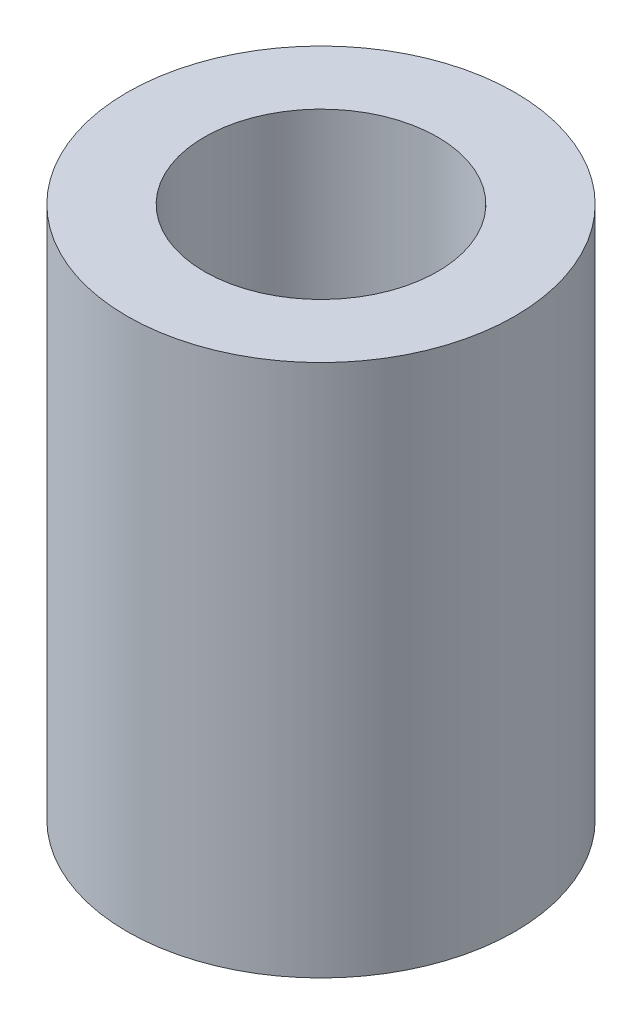
ISO-10303-21;
HEADER;
FILE_DESCRIPTION(('STEP AP214'),'2;1');
FILE_NAME('part.step','',(''),(''),'','','');
FILE_SCHEMA(('AUTOMOTIVE_DESIGN { 1 0 10303 214 1 1 1 1 }'));
ENDSEC;
DATA;
#1=APPLICATION_CONTEXT('core data for automotive mechanical design processes');
#2=APPLICATION_PROTOCOL_DEFINITION('international standard','automotive_design',2000,#1);
#3=PRODUCT_CONTEXT('',#1,'mechanical');
#4=PRODUCT('Part','Part','',(#3));
#5=PRODUCT_RELATED_PRODUCT_CATEGORY('part','',(#4));
#6=PRODUCT_DEFINITION_FORMATION('','',#4);
#7=PRODUCT_DEFINITION_CONTEXT('part definition',#1,'design');
#8=PRODUCT_DEFINITION('design','',#6,#7);
#9=PRODUCT_DEFINITION_SHAPE('','',#8);
#10=(LENGTH_UNIT() NAMED_UNIT(*) SI_UNIT(.MILLI.,.METRE.));
#11=(NAMED_UNIT(*) PLANE_ANGLE_UNIT() SI_UNIT($,.RADIAN.));
#12=(NAMED_UNIT(*) SI_UNIT($,.STERADIAN.) SOLID_ANGLE_UNIT());
#13=UNCERTAINTY_MEASURE_WITH_UNIT(LENGTH_MEASURE(1.E-05),#10,'distance_accuracy_value','');
#14=(GEOMETRIC_REPRESENTATION_CONTEXT(3) GLOBAL_UNCERTAINTY_ASSIGNED_CONTEXT((#13)) GLOBAL_UNIT_ASSIGNED_CONTEXT((#10,
#11,#12)) REPRESENTATION_CONTEXT('',''));
#15=CARTESIAN_POINT('',(0.,0.,0.));
#16=DIRECTION('',(0.,0.,1.));
#17=DIRECTION('',(1.,0.,0.));
#18=AXIS2_PLACEMENT_3D('',#15,#16,#17);
#19=CARTESIAN_POINT('',(0.,8.,0.));
#20=DIRECTION('',(0.,1.,0.));
#21=DIRECTION('',(0.,0.,1.));
#22=AXIS2_PLACEMENT_3D('',#19,#20,#21);
#23=PLANE('',#22);
#24=CARTESIAN_POINT('',(0.,8.,0.));
#25=DIRECTION('',(0.,1.,0.));
#26=DIRECTION('',(0.,0.,1.));
#27=AXIS2_PLACEMENT_3D('',#24,#25,#26);
#28=CIRCLE('',#27,2.910000014);
#29=CARTESIAN_POINT('',(0.,8.,2.910000014));
#30=VERTEX_POINT('',#29);
#31=EDGE_CURVE('E10',#30,#30,#28,.T.);
#32=ORIENTED_EDGE('',*,*,#31,.T.);
#33=EDGE_LOOP('',(#32));
#34=FACE_BOUND('',#33,.T.);
#35=CARTESIAN_POINT('',(0.,8.,0.));
#36=DIRECTION('',(0.,1.,0.));
#37=DIRECTION('',(0.,0.,1.));
#38=AXIS2_PLACEMENT_3D('',#35,#36,#37);
#39=CIRCLE('',#38,1.75);
#40=CARTESIAN_POINT('',(0.,8.,1.75));
#41=VERTEX_POINT('',#40);
#42=EDGE_CURVE('E56',#41,#41,#39,.T.);
#43=ORIENTED_EDGE('',*,*,#42,.F.);
#44=EDGE_LOOP('',(#43));
#45=FACE_BOUND('',#44,.T.);
#46=ADVANCED_FACE('F43',(#34,#45),#23,.T.);
#47=CARTESIAN_POINT('',(0.,0.,0.));
#48=DIRECTION('',(0.,1.,0.));
#49=DIRECTION('',(0.,0.,1.));
#50=AXIS2_PLACEMENT_3D('',#47,#48,#49);
#51=PLANE('',#50);
#52=CARTESIAN_POINT('',(0.,0.,0.));
#53=DIRECTION('',(0.,1.,0.));
#54=DIRECTION('',(0.,0.,1.));
#55=AXIS2_PLACEMENT_3D('',#52,#53,#54);
#56=CIRCLE('',#55,2.910000014);
#57=CARTESIAN_POINT('',(0.,0.,2.910000014));
#58=VERTEX_POINT('',#57);
#59=EDGE_CURVE('E47',#58,#58,#56,.T.);
#60=ORIENTED_EDGE('',*,*,#59,.F.);
#61=EDGE_LOOP('',(#60));
#62=FACE_BOUND('',#61,.T.);
#63=CARTESIAN_POINT('',(0.,0.,0.));
#64=DIRECTION('',(0.,1.,0.));
#65=DIRECTION('',(0.,0.,1.));
#66=AXIS2_PLACEMENT_3D('',#63,#64,#65);
#67=CIRCLE('',#66,1.75);
#68=CARTESIAN_POINT('',(0.,0.,1.75));
#69=VERTEX_POINT('',#68);
#70=EDGE_CURVE('E58',#69,#69,#67,.T.);
#71=ORIENTED_EDGE('',*,*,#70,.T.);
#72=EDGE_LOOP('',(#71));
#73=FACE_BOUND('',#72,.T.);
#74=ADVANCED_FACE('F70',(#62,#73),#51,.F.);
#75=CARTESIAN_POINT('',(0.,8.,0.));
#76=DIRECTION('',(0.,-1.,0.));
#77=DIRECTION('',(0.,0.,-1.));
#78=AXIS2_PLACEMENT_3D('',#75,#76,#77);
#79=CYLINDRICAL_SURFACE('',#78,2.910000014);
#80=ORIENTED_EDGE('',*,*,#31,.F.);
#81=EDGE_LOOP('',(#80));
#82=FACE_BOUND('',#81,.T.);
#83=ORIENTED_EDGE('',*,*,#59,.T.);
#84=EDGE_LOOP('',(#83));
#85=FACE_BOUND('',#84,.T.);
#86=ADVANCED_FACE('F45',(#82,#85),#79,.T.);
#87=CARTESIAN_POINT('',(0.,8.,0.));
#88=DIRECTION('',(0.,-1.,0.));
#89=DIRECTION('',(0.,0.,-1.));
#90=AXIS2_PLACEMENT_3D('',#87,#88,#89);
#91=CYLINDRICAL_SURFACE('',#90,1.75);
#92=ORIENTED_EDGE('',*,*,#42,.T.);
#93=EDGE_LOOP('',(#92));
#94=FACE_BOUND('',#93,.T.);
#95=ORIENTED_EDGE('',*,*,#70,.F.);
#96=EDGE_LOOP('',(#95));
#97=FACE_BOUND('',#96,.T.);
#98=ADVANCED_FACE('F66',(#94,#97),#91,.F.);
#99=CLOSED_SHELL('',(#46,#74,#86,#98));
#100=MANIFOLD_SOLID_BREP('B2',#99);
#101=ADVANCED_BREP_SHAPE_REPRESENTATION('',(#18,#100),#14);
#102=SHAPE_DEFINITION_REPRESENTATION(#9,#101);
ENDSEC;
END-ISO-10303-21;
